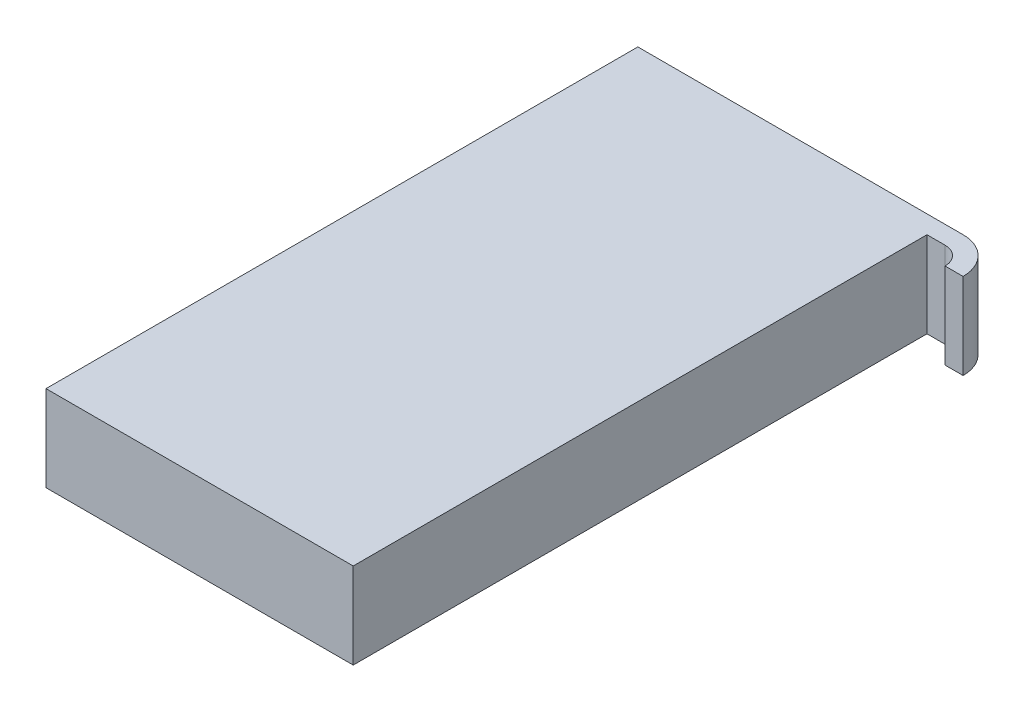
ISO-10303-21;
HEADER;
FILE_DESCRIPTION(('STEP AP214'),'2;1');
FILE_NAME('part.step','',(''),(''),'','','');
FILE_SCHEMA(('AUTOMOTIVE_DESIGN { 1 0 10303 214 1 1 1 1 }'));
ENDSEC;
DATA;
#1=APPLICATION_CONTEXT('core data for automotive mechanical design processes');
#2=APPLICATION_PROTOCOL_DEFINITION('international standard','automotive_design',2000,#1);
#3=PRODUCT_CONTEXT('',#1,'mechanical');
#4=PRODUCT('Part','Part','',(#3));
#5=PRODUCT_RELATED_PRODUCT_CATEGORY('part','',(#4));
#6=PRODUCT_DEFINITION_FORMATION('','',#4);
#7=PRODUCT_DEFINITION_CONTEXT('part definition',#1,'design');
#8=PRODUCT_DEFINITION('design','',#6,#7);
#9=PRODUCT_DEFINITION_SHAPE('','',#8);
#10=(LENGTH_UNIT() NAMED_UNIT(*) SI_UNIT(.MILLI.,.METRE.));
#11=(NAMED_UNIT(*) PLANE_ANGLE_UNIT() SI_UNIT($,.RADIAN.));
#12=(NAMED_UNIT(*) SI_UNIT($,.STERADIAN.) SOLID_ANGLE_UNIT());
#13=UNCERTAINTY_MEASURE_WITH_UNIT(LENGTH_MEASURE(1.E-05),#10,'distance_accuracy_value','');
#14=(GEOMETRIC_REPRESENTATION_CONTEXT(3) GLOBAL_UNCERTAINTY_ASSIGNED_CONTEXT((#13)) GLOBAL_UNIT_ASSIGNED_CONTEXT((#10,
#11,#12)) REPRESENTATION_CONTEXT('',''));
#15=CARTESIAN_POINT('',(0.,0.,0.));
#16=DIRECTION('',(0.,0.,1.));
#17=DIRECTION('',(1.,0.,0.));
#18=AXIS2_PLACEMENT_3D('',#15,#16,#17);
#19=CARTESIAN_POINT('',(0.,9.5,32.75));
#20=DIRECTION('',(0.,0.,-1.));
#21=DIRECTION('',(-1.,0.,0.));
#22=AXIS2_PLACEMENT_3D('',#19,#20,#21);
#23=PLANE('',#22);
#24=DIRECTION('',(1.,0.,0.));
#25=VECTOR('',#24,1.);
#26=CARTESIAN_POINT('',(0.,0.,32.75));
#27=LINE('',#26,#25);
#28=CARTESIAN_POINT('',(-17.,0.,32.75));
#29=VERTEX_POINT('',#28);
#30=CARTESIAN_POINT('',(17.,0.,32.75));
#31=VERTEX_POINT('',#30);
#32=EDGE_CURVE('E132',#29,#31,#27,.T.);
#33=ORIENTED_EDGE('',*,*,#32,.T.);
#34=DIRECTION('',(0.,-1.,0.));
#35=VECTOR('',#34,1.);
#36=CARTESIAN_POINT('',(17.,9.5,32.75));
#37=LINE('',#36,#35);
#38=CARTESIAN_POINT('',(17.,9.5,32.75));
#39=VERTEX_POINT('',#38);
#40=EDGE_CURVE('E11',#39,#31,#37,.T.);
#41=ORIENTED_EDGE('',*,*,#40,.F.);
#42=DIRECTION('',(1.,0.,0.));
#43=VECTOR('',#42,1.);
#44=CARTESIAN_POINT('',(0.,9.5,32.75));
#45=LINE('',#44,#43);
#46=CARTESIAN_POINT('',(-17.,9.5,32.75));
#47=VERTEX_POINT('',#46);
#48=EDGE_CURVE('E152',#47,#39,#45,.T.);
#49=ORIENTED_EDGE('',*,*,#48,.F.);
#50=DIRECTION('',(0.,-1.,0.));
#51=VECTOR('',#50,1.);
#52=CARTESIAN_POINT('',(-17.,9.5,32.75));
#53=LINE('',#52,#51);
#54=EDGE_CURVE('E51',#47,#29,#53,.T.);
#55=ORIENTED_EDGE('',*,*,#54,.T.);
#56=EDGE_LOOP('',(#33,#41,#49,#55));
#57=FACE_BOUND('',#56,.T.);
#58=ADVANCED_FACE('F35',(#57),#23,.F.);
#59=CARTESIAN_POINT('',(17.,9.5,0.));
#60=DIRECTION('',(-1.,0.,0.));
#61=DIRECTION('',(0.,0.,1.));
#62=AXIS2_PLACEMENT_3D('',#59,#60,#61);
#63=PLANE('',#62);
#64=DIRECTION('',(0.,0.,-1.));
#65=VECTOR('',#64,1.);
#66=CARTESIAN_POINT('',(17.,0.,0.));
#67=LINE('',#66,#65);
#68=CARTESIAN_POINT('',(17.,0.,-30.75));
#69=VERTEX_POINT('',#68);
#70=EDGE_CURVE('E134',#31,#69,#67,.T.);
#71=ORIENTED_EDGE('',*,*,#70,.T.);
#72=DIRECTION('',(0.,-1.,0.));
#73=VECTOR('',#72,1.);
#74=CARTESIAN_POINT('',(17.,9.5,-30.75));
#75=LINE('',#74,#73);
#76=CARTESIAN_POINT('',(17.,9.5,-30.75));
#77=VERTEX_POINT('',#76);
#78=EDGE_CURVE('E43',#77,#69,#75,.T.);
#79=ORIENTED_EDGE('',*,*,#78,.F.);
#80=DIRECTION('',(0.,0.,-1.));
#81=VECTOR('',#80,1.);
#82=CARTESIAN_POINT('',(17.,9.5,0.));
#83=LINE('',#82,#81);
#84=EDGE_CURVE('E89',#39,#77,#83,.T.);
#85=ORIENTED_EDGE('',*,*,#84,.F.);
#86=ORIENTED_EDGE('',*,*,#40,.T.);
#87=EDGE_LOOP('',(#71,#79,#85,#86));
#88=FACE_BOUND('',#87,.T.);
#89=ADVANCED_FACE('F165',(#88),#63,.F.);
#90=CARTESIAN_POINT('',(0.,9.5,-30.75));
#91=DIRECTION('',(0.,0.,1.));
#92=DIRECTION('',(1.,0.,0.));
#93=AXIS2_PLACEMENT_3D('',#90,#91,#92);
#94=PLANE('',#93);
#95=DIRECTION('',(-1.,0.,0.));
#96=VECTOR('',#95,1.);
#97=CARTESIAN_POINT('',(0.,0.,-30.75));
#98=LINE('',#97,#96);
#99=CARTESIAN_POINT('',(19.,0.,-30.75));
#100=VERTEX_POINT('',#99);
#101=EDGE_CURVE('E137',#100,#69,#98,.T.);
#102=ORIENTED_EDGE('',*,*,#101,.F.);
#103=DIRECTION('',(0.,-1.,0.));
#104=VECTOR('',#103,1.);
#105=CARTESIAN_POINT('',(19.,9.5,-30.75));
#106=LINE('',#105,#104);
#107=CARTESIAN_POINT('',(19.,9.5,-30.75));
#108=VERTEX_POINT('',#107);
#109=EDGE_CURVE('E158',#108,#100,#106,.T.);
#110=ORIENTED_EDGE('',*,*,#109,.F.);
#111=DIRECTION('',(-1.,0.,0.));
#112=VECTOR('',#111,1.);
#113=CARTESIAN_POINT('',(0.,9.5,-30.75));
#114=LINE('',#113,#112);
#115=EDGE_CURVE('E164',#108,#77,#114,.T.);
#116=ORIENTED_EDGE('',*,*,#115,.T.);
#117=ORIENTED_EDGE('',*,*,#78,.T.);
#118=EDGE_LOOP('',(#102,#110,#116,#117));
#119=FACE_BOUND('',#118,.T.);
#120=ADVANCED_FACE('F162',(#119),#94,.T.);
#121=CARTESIAN_POINT('',(19.,9.5,-28.75));
#122=DIRECTION('',(0.,-1.,0.));
#123=DIRECTION('',(0.,0.,-1.));
#124=AXIS2_PLACEMENT_3D('',#121,#122,#123);
#125=CYLINDRICAL_SURFACE('',#124,2.);
#126=CARTESIAN_POINT('',(19.,0.,-28.75));
#127=DIRECTION('',(0.,1.,0.));
#128=DIRECTION('',(0.,0.,1.));
#129=AXIS2_PLACEMENT_3D('',#126,#127,#128);
#130=CIRCLE('',#129,2.);
#131=CARTESIAN_POINT('',(21.,0.,-28.75));
#132=VERTEX_POINT('',#131);
#133=EDGE_CURVE('E140',#132,#100,#130,.T.);
#134=ORIENTED_EDGE('',*,*,#133,.F.);
#135=DIRECTION('',(0.,-1.,0.));
#136=VECTOR('',#135,1.);
#137=CARTESIAN_POINT('',(21.,9.5,-28.75));
#138=LINE('',#137,#136);
#139=CARTESIAN_POINT('',(21.,9.5,-28.75));
#140=VERTEX_POINT('',#139);
#141=EDGE_CURVE('E156',#140,#132,#138,.T.);
#142=ORIENTED_EDGE('',*,*,#141,.F.);
#143=CARTESIAN_POINT('',(19.,9.5,-28.75));
#144=DIRECTION('',(0.,1.,0.));
#145=DIRECTION('',(0.,0.,1.));
#146=AXIS2_PLACEMENT_3D('',#143,#144,#145);
#147=CIRCLE('',#146,2.);
#148=EDGE_CURVE('E174',#140,#108,#147,.T.);
#149=ORIENTED_EDGE('',*,*,#148,.T.);
#150=ORIENTED_EDGE('',*,*,#109,.T.);
#151=EDGE_LOOP('',(#134,#142,#149,#150));
#152=FACE_BOUND('',#151,.T.);
#153=ADVANCED_FACE('F172',(#152),#125,.F.);
#154=CARTESIAN_POINT('',(0.,9.5,-28.75));
#155=DIRECTION('',(0.,0.,1.));
#156=DIRECTION('',(1.,0.,0.));
#157=AXIS2_PLACEMENT_3D('',#154,#155,#156);
#158=PLANE('',#157);
#159=DIRECTION('',(-1.,0.,0.));
#160=VECTOR('',#159,1.);
#161=CARTESIAN_POINT('',(0.,0.,-28.75));
#162=LINE('',#161,#160);
#163=CARTESIAN_POINT('',(23.,0.,-28.75));
#164=VERTEX_POINT('',#163);
#165=EDGE_CURVE('E143',#164,#132,#162,.T.);
#166=ORIENTED_EDGE('',*,*,#165,.F.);
#167=DIRECTION('',(0.,-1.,0.));
#168=VECTOR('',#167,1.);
#169=CARTESIAN_POINT('',(23.,9.5,-28.75));
#170=LINE('',#169,#168);
#171=CARTESIAN_POINT('',(23.,9.5,-28.75));
#172=VERTEX_POINT('',#171);
#173=EDGE_CURVE('E114',#172,#164,#170,.T.);
#174=ORIENTED_EDGE('',*,*,#173,.F.);
#175=DIRECTION('',(-1.,0.,0.));
#176=VECTOR('',#175,1.);
#177=CARTESIAN_POINT('',(0.,9.5,-28.75));
#178=LINE('',#177,#176);
#179=EDGE_CURVE('E124',#172,#140,#178,.T.);
#180=ORIENTED_EDGE('',*,*,#179,.T.);
#181=ORIENTED_EDGE('',*,*,#141,.T.);
#182=EDGE_LOOP('',(#166,#174,#180,#181));
#183=FACE_BOUND('',#182,.T.);
#184=ADVANCED_FACE('F180',(#183),#158,.T.);
#185=CARTESIAN_POINT('',(19.,9.5,-28.75));
#186=DIRECTION('',(0.,-1.,0.));
#187=DIRECTION('',(0.,0.,-1.));
#188=AXIS2_PLACEMENT_3D('',#185,#186,#187);
#189=CYLINDRICAL_SURFACE('',#188,4.);
#190=CARTESIAN_POINT('',(19.,0.,-28.75));
#191=DIRECTION('',(0.,1.,0.));
#192=DIRECTION('',(0.,0.,1.));
#193=AXIS2_PLACEMENT_3D('',#190,#191,#192);
#194=CIRCLE('',#193,4.);
#195=CARTESIAN_POINT('',(19.,0.,-32.75));
#196=VERTEX_POINT('',#195);
#197=EDGE_CURVE('E110',#196,#164,#194,.F.);
#198=ORIENTED_EDGE('',*,*,#197,.F.);
#199=DIRECTION('',(0.,-1.,0.));
#200=VECTOR('',#199,1.);
#201=CARTESIAN_POINT('',(19.,9.5,-32.75));
#202=LINE('',#201,#200);
#203=CARTESIAN_POINT('',(19.,9.5,-32.75));
#204=VERTEX_POINT('',#203);
#205=EDGE_CURVE('E105',#204,#196,#202,.T.);
#206=ORIENTED_EDGE('',*,*,#205,.F.);
#207=CARTESIAN_POINT('',(19.,9.5,-28.75));
#208=DIRECTION('',(0.,1.,0.));
#209=DIRECTION('',(0.,0.,1.));
#210=AXIS2_PLACEMENT_3D('',#207,#208,#209);
#211=CIRCLE('',#210,4.);
#212=EDGE_CURVE('E108',#204,#172,#211,.F.);
#213=ORIENTED_EDGE('',*,*,#212,.T.);
#214=ORIENTED_EDGE('',*,*,#173,.T.);
#215=EDGE_LOOP('',(#198,#206,#213,#214));
#216=FACE_BOUND('',#215,.T.);
#217=ADVANCED_FACE('F107',(#216),#189,.T.);
#218=CARTESIAN_POINT('',(0.,9.5,-32.75));
#219=DIRECTION('',(0.,0.,-1.));
#220=DIRECTION('',(-1.,0.,0.));
#221=AXIS2_PLACEMENT_3D('',#218,#219,#220);
#222=PLANE('',#221);
#223=DIRECTION('',(1.,0.,0.));
#224=VECTOR('',#223,1.);
#225=CARTESIAN_POINT('',(0.,0.,-32.75));
#226=LINE('',#225,#224);
#227=CARTESIAN_POINT('',(-17.,0.,-32.75));
#228=VERTEX_POINT('',#227);
#229=EDGE_CURVE('E147',#228,#196,#226,.T.);
#230=ORIENTED_EDGE('',*,*,#229,.F.);
#231=DIRECTION('',(0.,-1.,0.));
#232=VECTOR('',#231,1.);
#233=CARTESIAN_POINT('',(-17.,9.5,-32.75));
#234=LINE('',#233,#232);
#235=CARTESIAN_POINT('',(-17.,9.5,-32.75));
#236=VERTEX_POINT('',#235);
#237=EDGE_CURVE('E77',#236,#228,#234,.T.);
#238=ORIENTED_EDGE('',*,*,#237,.F.);
#239=DIRECTION('',(1.,0.,0.));
#240=VECTOR('',#239,1.);
#241=CARTESIAN_POINT('',(0.,9.5,-32.75));
#242=LINE('',#241,#240);
#243=EDGE_CURVE('E121',#236,#204,#242,.T.);
#244=ORIENTED_EDGE('',*,*,#243,.T.);
#245=ORIENTED_EDGE('',*,*,#205,.T.);
#246=EDGE_LOOP('',(#230,#238,#244,#245));
#247=FACE_BOUND('',#246,.T.);
#248=ADVANCED_FACE('F126',(#247),#222,.T.);
#249=CARTESIAN_POINT('',(-17.,9.5,0.));
#250=DIRECTION('',(-1.,0.,0.));
#251=DIRECTION('',(0.,0.,1.));
#252=AXIS2_PLACEMENT_3D('',#249,#250,#251);
#253=PLANE('',#252);
#254=DIRECTION('',(0.,0.,-1.));
#255=VECTOR('',#254,1.);
#256=CARTESIAN_POINT('',(-17.,0.,0.));
#257=LINE('',#256,#255);
#258=EDGE_CURVE('E149',#29,#228,#257,.T.);
#259=ORIENTED_EDGE('',*,*,#258,.F.);
#260=ORIENTED_EDGE('',*,*,#54,.F.);
#261=DIRECTION('',(0.,0.,-1.));
#262=VECTOR('',#261,1.);
#263=CARTESIAN_POINT('',(-17.,9.5,0.));
#264=LINE('',#263,#262);
#265=EDGE_CURVE('E127',#47,#236,#264,.T.);
#266=ORIENTED_EDGE('',*,*,#265,.T.);
#267=ORIENTED_EDGE('',*,*,#237,.T.);
#268=EDGE_LOOP('',(#259,#260,#266,#267));
#269=FACE_BOUND('',#268,.T.);
#270=ADVANCED_FACE('F181',(#269),#253,.T.);
#271=CARTESIAN_POINT('',(0.,9.5,0.));
#272=DIRECTION('',(0.,1.,0.));
#273=DIRECTION('',(0.,0.,1.));
#274=AXIS2_PLACEMENT_3D('',#271,#272,#273);
#275=PLANE('',#274);
#276=ORIENTED_EDGE('',*,*,#48,.T.);
#277=ORIENTED_EDGE('',*,*,#84,.T.);
#278=ORIENTED_EDGE('',*,*,#115,.F.);
#279=ORIENTED_EDGE('',*,*,#148,.F.);
#280=ORIENTED_EDGE('',*,*,#179,.F.);
#281=ORIENTED_EDGE('',*,*,#212,.F.);
#282=ORIENTED_EDGE('',*,*,#243,.F.);
#283=ORIENTED_EDGE('',*,*,#265,.F.);
#284=EDGE_LOOP('',(#276,#277,#278,#279,#280,#281,#282,#283));
#285=FACE_BOUND('',#284,.T.);
#286=ADVANCED_FACE('F119',(#285),#275,.T.);
#287=CARTESIAN_POINT('',(0.,0.,0.));
#288=DIRECTION('',(0.,1.,0.));
#289=DIRECTION('',(0.,0.,1.));
#290=AXIS2_PLACEMENT_3D('',#287,#288,#289);
#291=PLANE('',#290);
#292=ORIENTED_EDGE('',*,*,#32,.F.);
#293=ORIENTED_EDGE('',*,*,#258,.T.);
#294=ORIENTED_EDGE('',*,*,#229,.T.);
#295=ORIENTED_EDGE('',*,*,#197,.T.);
#296=ORIENTED_EDGE('',*,*,#165,.T.);
#297=ORIENTED_EDGE('',*,*,#133,.T.);
#298=ORIENTED_EDGE('',*,*,#101,.T.);
#299=ORIENTED_EDGE('',*,*,#70,.F.);
#300=EDGE_LOOP('',(#292,#293,#294,#295,#296,#297,#298,#299));
#301=FACE_BOUND('',#300,.T.);
#302=ADVANCED_FACE('F168',(#301),#291,.F.);
#303=CLOSED_SHELL('',(#58,#89,#120,#153,#184,#217,#248,#270,#286,#302));
#304=MANIFOLD_SOLID_BREP('B2',#303);
#305=ADVANCED_BREP_SHAPE_REPRESENTATION('',(#18,#304),#14);
#306=SHAPE_DEFINITION_REPRESENTATION(#9,#305);
ENDSEC;
END-ISO-10303-21;
